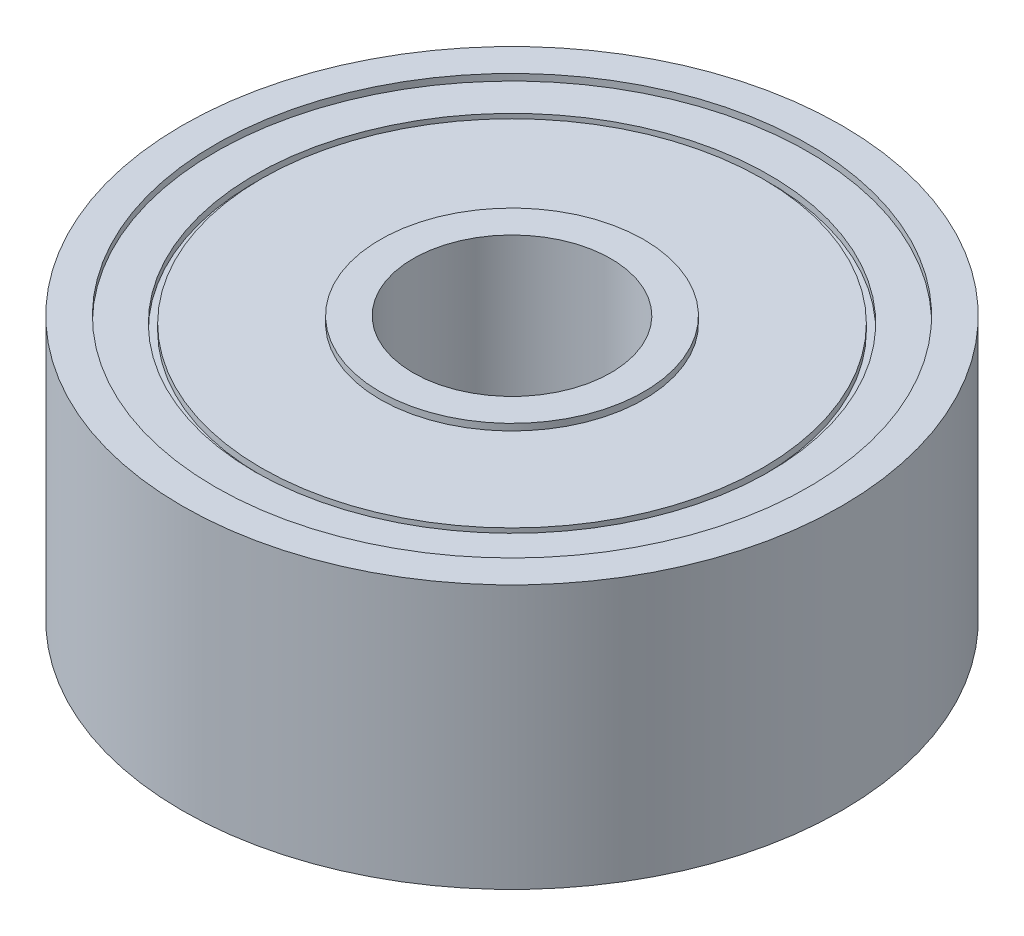
ISO-10303-21;
HEADER;
FILE_DESCRIPTION(('STEP AP214'),'2;1');
FILE_NAME('part.step','',(''),(''),'','','');
FILE_SCHEMA(('AUTOMOTIVE_DESIGN { 1 0 10303 214 1 1 1 1 }'));
ENDSEC;
DATA;
#1=APPLICATION_CONTEXT('core data for automotive mechanical design processes');
#2=APPLICATION_PROTOCOL_DEFINITION('international standard','automotive_design',2000,#1);
#3=PRODUCT_CONTEXT('',#1,'mechanical');
#4=PRODUCT('Part','Part','',(#3));
#5=PRODUCT_RELATED_PRODUCT_CATEGORY('part','',(#4));
#6=PRODUCT_DEFINITION_FORMATION('','',#4);
#7=PRODUCT_DEFINITION_CONTEXT('part definition',#1,'design');
#8=PRODUCT_DEFINITION('design','',#6,#7);
#9=PRODUCT_DEFINITION_SHAPE('','',#8);
#10=(LENGTH_UNIT() NAMED_UNIT(*) SI_UNIT(.MILLI.,.METRE.));
#11=(NAMED_UNIT(*) PLANE_ANGLE_UNIT() SI_UNIT($,.RADIAN.));
#12=(NAMED_UNIT(*) SI_UNIT($,.STERADIAN.) SOLID_ANGLE_UNIT());
#13=UNCERTAINTY_MEASURE_WITH_UNIT(LENGTH_MEASURE(1.E-05),#10,'distance_accuracy_value','');
#14=(GEOMETRIC_REPRESENTATION_CONTEXT(3) GLOBAL_UNCERTAINTY_ASSIGNED_CONTEXT((#13)) GLOBAL_UNIT_ASSIGNED_CONTEXT((#10,
#11,#12)) REPRESENTATION_CONTEXT('',''));
#15=CARTESIAN_POINT('',(0.,0.,0.));
#16=DIRECTION('',(0.,0.,1.));
#17=DIRECTION('',(1.,0.,0.));
#18=AXIS2_PLACEMENT_3D('',#15,#16,#17);
#19=CARTESIAN_POINT('',(0.,-1.9,0.));
#20=DIRECTION('',(0.,-1.,0.));
#21=DIRECTION('',(0.,0.,1.));
#22=AXIS2_PLACEMENT_3D('',#19,#20,#21);
#23=PLANE('',#22);
#24=CARTESIAN_POINT('',(0.,-1.9,0.));
#25=DIRECTION('',(0.,1.,0.));
#26=DIRECTION('',(0.,0.,1.));
#27=AXIS2_PLACEMENT_3D('',#24,#25,#26);
#28=CIRCLE('',#27,2.);
#29=CARTESIAN_POINT('',(0.,-1.9,2.));
#30=VERTEX_POINT('',#29);
#31=EDGE_CURVE('E80',#30,#30,#28,.T.);
#32=ORIENTED_EDGE('',*,*,#31,.T.);
#33=EDGE_LOOP('',(#32));
#34=FACE_BOUND('',#33,.T.);
#35=CARTESIAN_POINT('',(0.,-1.9,0.));
#36=DIRECTION('',(0.,1.,0.));
#37=DIRECTION('',(0.,0.,1.));
#38=AXIS2_PLACEMENT_3D('',#35,#36,#37);
#39=CIRCLE('',#38,3.8);
#40=CARTESIAN_POINT('',(0.,-1.9,3.8));
#41=VERTEX_POINT('',#40);
#42=EDGE_CURVE('E95',#41,#41,#39,.T.);
#43=ORIENTED_EDGE('',*,*,#42,.F.);
#44=EDGE_LOOP('',(#43));
#45=FACE_BOUND('',#44,.T.);
#46=ADVANCED_FACE('F34',(#34,#45),#23,.T.);
#47=CARTESIAN_POINT('',(0.,-2.,0.));
#48=DIRECTION('',(0.,1.,0.));
#49=DIRECTION('',(0.,0.,1.));
#50=AXIS2_PLACEMENT_3D('',#47,#48,#49);
#51=PLANE('',#50);
#52=CARTESIAN_POINT('',(0.,-2.,0.));
#53=DIRECTION('',(0.,1.,0.));
#54=DIRECTION('',(0.,0.,1.));
#55=AXIS2_PLACEMENT_3D('',#52,#53,#54);
#56=CIRCLE('',#55,1.5);
#57=CARTESIAN_POINT('',(0.,-2.,1.5));
#58=VERTEX_POINT('',#57);
#59=EDGE_CURVE('E47',#58,#58,#56,.T.);
#60=ORIENTED_EDGE('',*,*,#59,.T.);
#61=EDGE_LOOP('',(#60));
#62=FACE_BOUND('',#61,.T.);
#63=CARTESIAN_POINT('',(0.,-2.,0.));
#64=DIRECTION('',(0.,1.,0.));
#65=DIRECTION('',(0.,0.,1.));
#66=AXIS2_PLACEMENT_3D('',#63,#64,#65);
#67=CIRCLE('',#66,2.);
#68=CARTESIAN_POINT('',(0.,-2.,2.));
#69=VERTEX_POINT('',#68);
#70=EDGE_CURVE('E83',#69,#69,#67,.T.);
#71=ORIENTED_EDGE('',*,*,#70,.F.);
#72=EDGE_LOOP('',(#71));
#73=FACE_BOUND('',#72,.T.);
#74=ADVANCED_FACE('F111',(#62,#73),#51,.F.);
#75=CARTESIAN_POINT('',(0.,1.9,0.));
#76=DIRECTION('',(0.,1.,0.));
#77=DIRECTION('',(0.,0.,1.));
#78=AXIS2_PLACEMENT_3D('',#75,#76,#77);
#79=PLANE('',#78);
#80=CARTESIAN_POINT('',(0.,1.9,0.));
#81=DIRECTION('',(0.,1.,0.));
#82=DIRECTION('',(0.,0.,1.));
#83=AXIS2_PLACEMENT_3D('',#80,#81,#82);
#84=CIRCLE('',#83,2.);
#85=CARTESIAN_POINT('',(0.,1.9,2.));
#86=VERTEX_POINT('',#85);
#87=EDGE_CURVE('E56',#86,#86,#84,.T.);
#88=ORIENTED_EDGE('',*,*,#87,.F.);
#89=EDGE_LOOP('',(#88));
#90=FACE_BOUND('',#89,.T.);
#91=CARTESIAN_POINT('',(0.,1.9,0.));
#92=DIRECTION('',(0.,1.,0.));
#93=DIRECTION('',(0.,0.,1.));
#94=AXIS2_PLACEMENT_3D('',#91,#92,#93);
#95=CIRCLE('',#94,3.8);
#96=CARTESIAN_POINT('',(0.,1.9,3.8));
#97=VERTEX_POINT('',#96);
#98=EDGE_CURVE('E71',#97,#97,#95,.T.);
#99=ORIENTED_EDGE('',*,*,#98,.T.);
#100=EDGE_LOOP('',(#99));
#101=FACE_BOUND('',#100,.T.);
#102=ADVANCED_FACE('F118',(#90,#101),#79,.T.);
#103=CARTESIAN_POINT('',(0.,2.,0.));
#104=DIRECTION('',(0.,1.,0.));
#105=DIRECTION('',(0.,0.,1.));
#106=AXIS2_PLACEMENT_3D('',#103,#104,#105);
#107=PLANE('',#106);
#108=CARTESIAN_POINT('',(0.,2.,0.));
#109=DIRECTION('',(0.,1.,0.));
#110=DIRECTION('',(0.,0.,1.));
#111=AXIS2_PLACEMENT_3D('',#108,#109,#110);
#112=CIRCLE('',#111,1.5);
#113=CARTESIAN_POINT('',(0.,2.,1.5));
#114=VERTEX_POINT('',#113);
#115=EDGE_CURVE('E45',#114,#114,#112,.T.);
#116=ORIENTED_EDGE('',*,*,#115,.F.);
#117=EDGE_LOOP('',(#116));
#118=FACE_BOUND('',#117,.T.);
#119=CARTESIAN_POINT('',(0.,2.,0.));
#120=DIRECTION('',(0.,1.,0.));
#121=DIRECTION('',(0.,0.,1.));
#122=AXIS2_PLACEMENT_3D('',#119,#120,#121);
#123=CIRCLE('',#122,2.);
#124=CARTESIAN_POINT('',(0.,2.,2.));
#125=VERTEX_POINT('',#124);
#126=EDGE_CURVE('E59',#125,#125,#123,.T.);
#127=ORIENTED_EDGE('',*,*,#126,.T.);
#128=EDGE_LOOP('',(#127));
#129=FACE_BOUND('',#128,.T.);
#130=ADVANCED_FACE('F166',(#118,#129),#107,.T.);
#131=CARTESIAN_POINT('',(0.,2.,0.));
#132=DIRECTION('',(0.,1.,0.));
#133=DIRECTION('',(0.,0.,1.));
#134=AXIS2_PLACEMENT_3D('',#131,#132,#133);
#135=CIRCLE('',#134,4.5);
#136=CARTESIAN_POINT('',(0.,2.,4.5));
#137=VERTEX_POINT('',#136);
#138=EDGE_CURVE('E53',#137,#137,#135,.T.);
#139=ORIENTED_EDGE('',*,*,#138,.F.);
#140=EDGE_LOOP('',(#139));
#141=FACE_BOUND('',#140,.T.);
#142=CARTESIAN_POINT('',(0.,2.,0.));
#143=DIRECTION('',(0.,1.,0.));
#144=DIRECTION('',(0.,0.,1.));
#145=AXIS2_PLACEMENT_3D('',#142,#143,#144);
#146=CIRCLE('',#145,5.);
#147=CARTESIAN_POINT('',(0.,2.,5.));
#148=VERTEX_POINT('',#147);
#149=EDGE_CURVE('E10',#148,#148,#146,.T.);
#150=ORIENTED_EDGE('',*,*,#149,.T.);
#151=EDGE_LOOP('',(#150));
#152=FACE_BOUND('',#151,.T.);
#153=ADVANCED_FACE('F144',(#141,#152),#107,.T.);
#154=CARTESIAN_POINT('',(0.,-2.,0.));
#155=DIRECTION('',(0.,1.,0.));
#156=DIRECTION('',(0.,0.,1.));
#157=AXIS2_PLACEMENT_3D('',#154,#155,#156);
#158=CIRCLE('',#157,4.5);
#159=CARTESIAN_POINT('',(0.,-2.,4.5));
#160=VERTEX_POINT('',#159);
#161=EDGE_CURVE('E77',#160,#160,#158,.T.);
#162=ORIENTED_EDGE('',*,*,#161,.T.);
#163=EDGE_LOOP('',(#162));
#164=FACE_BOUND('',#163,.T.);
#165=CARTESIAN_POINT('',(0.,-2.,0.));
#166=DIRECTION('',(0.,1.,0.));
#167=DIRECTION('',(0.,0.,1.));
#168=AXIS2_PLACEMENT_3D('',#165,#166,#167);
#169=CIRCLE('',#168,5.);
#170=CARTESIAN_POINT('',(0.,-2.,5.));
#171=VERTEX_POINT('',#170);
#172=EDGE_CURVE('E38',#171,#171,#169,.T.);
#173=ORIENTED_EDGE('',*,*,#172,.F.);
#174=EDGE_LOOP('',(#173));
#175=FACE_BOUND('',#174,.T.);
#176=ADVANCED_FACE('F120',(#164,#175),#51,.F.);
#177=CARTESIAN_POINT('',(0.,2.,0.));
#178=DIRECTION('',(0.,-1.,0.));
#179=DIRECTION('',(0.,0.,-1.));
#180=AXIS2_PLACEMENT_3D('',#177,#178,#179);
#181=CYLINDRICAL_SURFACE('',#180,5.);
#182=ORIENTED_EDGE('',*,*,#149,.F.);
#183=EDGE_LOOP('',(#182));
#184=FACE_BOUND('',#183,.T.);
#185=ORIENTED_EDGE('',*,*,#172,.T.);
#186=EDGE_LOOP('',(#185));
#187=FACE_BOUND('',#186,.T.);
#188=ADVANCED_FACE('F36',(#184,#187),#181,.T.);
#189=CARTESIAN_POINT('',(0.,2.,0.));
#190=DIRECTION('',(0.,-1.,0.));
#191=DIRECTION('',(0.,0.,-1.));
#192=AXIS2_PLACEMENT_3D('',#189,#190,#191);
#193=CYLINDRICAL_SURFACE('',#192,1.5);
#194=ORIENTED_EDGE('',*,*,#115,.T.);
#195=EDGE_LOOP('',(#194));
#196=FACE_BOUND('',#195,.T.);
#197=ORIENTED_EDGE('',*,*,#59,.F.);
#198=EDGE_LOOP('',(#197));
#199=FACE_BOUND('',#198,.T.);
#200=ADVANCED_FACE('F148',(#196,#199),#193,.F.);
#201=CARTESIAN_POINT('',(0.,1.9,0.));
#202=DIRECTION('',(0.,1.,0.));
#203=DIRECTION('',(0.,0.,1.));
#204=AXIS2_PLACEMENT_3D('',#201,#202,#203);
#205=CYLINDRICAL_SURFACE('',#204,4.5);
#206=CARTESIAN_POINT('',(0.,1.9,0.));
#207=DIRECTION('',(0.,1.,0.));
#208=DIRECTION('',(0.,0.,1.));
#209=AXIS2_PLACEMENT_3D('',#206,#207,#208);
#210=CIRCLE('',#209,4.5);
#211=CARTESIAN_POINT('',(0.,1.9,4.5));
#212=VERTEX_POINT('',#211);
#213=EDGE_CURVE('E50',#212,#212,#210,.T.);
#214=ORIENTED_EDGE('',*,*,#213,.F.);
#215=EDGE_LOOP('',(#214));
#216=FACE_BOUND('',#215,.T.);
#217=ORIENTED_EDGE('',*,*,#138,.T.);
#218=EDGE_LOOP('',(#217));
#219=FACE_BOUND('',#218,.T.);
#220=ADVANCED_FACE('F153',(#216,#219),#205,.F.);
#221=CARTESIAN_POINT('',(0.,1.9,0.));
#222=DIRECTION('',(0.,1.,0.));
#223=DIRECTION('',(0.,0.,1.));
#224=AXIS2_PLACEMENT_3D('',#221,#222,#223);
#225=CIRCLE('',#224,3.9);
#226=CARTESIAN_POINT('',(0.,1.9,3.9));
#227=VERTEX_POINT('',#226);
#228=EDGE_CURVE('E65',#227,#227,#225,.T.);
#229=ORIENTED_EDGE('',*,*,#228,.F.);
#230=EDGE_LOOP('',(#229));
#231=FACE_BOUND('',#230,.T.);
#232=ORIENTED_EDGE('',*,*,#213,.T.);
#233=EDGE_LOOP('',(#232));
#234=FACE_BOUND('',#233,.T.);
#235=ADVANCED_FACE('F159',(#231,#234),#79,.T.);
#236=CARTESIAN_POINT('',(0.,1.9,0.));
#237=DIRECTION('',(0.,1.,0.));
#238=DIRECTION('',(0.,0.,1.));
#239=AXIS2_PLACEMENT_3D('',#236,#237,#238);
#240=CYLINDRICAL_SURFACE('',#239,2.);
#241=ORIENTED_EDGE('',*,*,#87,.T.);
#242=EDGE_LOOP('',(#241));
#243=FACE_BOUND('',#242,.T.);
#244=ORIENTED_EDGE('',*,*,#126,.F.);
#245=EDGE_LOOP('',(#244));
#246=FACE_BOUND('',#245,.T.);
#247=ADVANCED_FACE('F182',(#243,#246),#240,.T.);
#248=CARTESIAN_POINT('',(0.,1.8,0.));
#249=DIRECTION('',(0.,1.,0.));
#250=DIRECTION('',(0.,0.,1.));
#251=AXIS2_PLACEMENT_3D('',#248,#249,#250);
#252=CYLINDRICAL_SURFACE('',#251,3.9);
#253=CARTESIAN_POINT('',(0.,1.8,0.));
#254=DIRECTION('',(0.,1.,0.));
#255=DIRECTION('',(0.,0.,1.));
#256=AXIS2_PLACEMENT_3D('',#253,#254,#255);
#257=CIRCLE('',#256,3.9);
#258=CARTESIAN_POINT('',(0.,1.8,3.9));
#259=VERTEX_POINT('',#258);
#260=EDGE_CURVE('E62',#259,#259,#257,.T.);
#261=ORIENTED_EDGE('',*,*,#260,.F.);
#262=EDGE_LOOP('',(#261));
#263=FACE_BOUND('',#262,.T.);
#264=ORIENTED_EDGE('',*,*,#228,.T.);
#265=EDGE_LOOP('',(#264));
#266=FACE_BOUND('',#265,.T.);
#267=ADVANCED_FACE('F184',(#263,#266),#252,.F.);
#268=CARTESIAN_POINT('',(0.,1.8,0.));
#269=DIRECTION('',(0.,1.,0.));
#270=DIRECTION('',(0.,0.,1.));
#271=AXIS2_PLACEMENT_3D('',#268,#269,#270);
#272=PLANE('',#271);
#273=CARTESIAN_POINT('',(0.,1.8,0.));
#274=DIRECTION('',(0.,1.,0.));
#275=DIRECTION('',(0.,0.,1.));
#276=AXIS2_PLACEMENT_3D('',#273,#274,#275);
#277=CIRCLE('',#276,3.8);
#278=CARTESIAN_POINT('',(0.,1.8,3.8));
#279=VERTEX_POINT('',#278);
#280=EDGE_CURVE('E68',#279,#279,#277,.T.);
#281=ORIENTED_EDGE('',*,*,#280,.F.);
#282=EDGE_LOOP('',(#281));
#283=FACE_BOUND('',#282,.T.);
#284=ORIENTED_EDGE('',*,*,#260,.T.);
#285=EDGE_LOOP('',(#284));
#286=FACE_BOUND('',#285,.T.);
#287=ADVANCED_FACE('F133',(#283,#286),#272,.T.);
#288=CARTESIAN_POINT('',(0.,1.8,0.));
#289=DIRECTION('',(0.,1.,0.));
#290=DIRECTION('',(0.,0.,1.));
#291=AXIS2_PLACEMENT_3D('',#288,#289,#290);
#292=CYLINDRICAL_SURFACE('',#291,3.8);
#293=ORIENTED_EDGE('',*,*,#280,.T.);
#294=EDGE_LOOP('',(#293));
#295=FACE_BOUND('',#294,.T.);
#296=ORIENTED_EDGE('',*,*,#98,.F.);
#297=EDGE_LOOP('',(#296));
#298=FACE_BOUND('',#297,.T.);
#299=ADVANCED_FACE('F125',(#295,#298),#292,.T.);
#300=CARTESIAN_POINT('',(0.,-1.9,0.));
#301=DIRECTION('',(0.,1.,0.));
#302=DIRECTION('',(0.,0.,1.));
#303=AXIS2_PLACEMENT_3D('',#300,#301,#302);
#304=CIRCLE('',#303,3.9);
#305=CARTESIAN_POINT('',(0.,-1.9,3.9));
#306=VERTEX_POINT('',#305);
#307=EDGE_CURVE('E89',#306,#306,#304,.T.);
#308=ORIENTED_EDGE('',*,*,#307,.T.);
#309=EDGE_LOOP('',(#308));
#310=FACE_BOUND('',#309,.T.);
#311=CARTESIAN_POINT('',(0.,-1.9,0.));
#312=DIRECTION('',(0.,1.,0.));
#313=DIRECTION('',(0.,0.,1.));
#314=AXIS2_PLACEMENT_3D('',#311,#312,#313);
#315=CIRCLE('',#314,4.5);
#316=CARTESIAN_POINT('',(0.,-1.9,4.5));
#317=VERTEX_POINT('',#316);
#318=EDGE_CURVE('E74',#317,#317,#315,.T.);
#319=ORIENTED_EDGE('',*,*,#318,.F.);
#320=EDGE_LOOP('',(#319));
#321=FACE_BOUND('',#320,.T.);
#322=ADVANCED_FACE('F114',(#310,#321),#23,.T.);
#323=CARTESIAN_POINT('',(0.,-1.9,0.));
#324=DIRECTION('',(0.,-1.,0.));
#325=DIRECTION('',(0.,0.,-1.));
#326=AXIS2_PLACEMENT_3D('',#323,#324,#325);
#327=CYLINDRICAL_SURFACE('',#326,4.5);
#328=ORIENTED_EDGE('',*,*,#318,.T.);
#329=EDGE_LOOP('',(#328));
#330=FACE_BOUND('',#329,.T.);
#331=ORIENTED_EDGE('',*,*,#161,.F.);
#332=EDGE_LOOP('',(#331));
#333=FACE_BOUND('',#332,.T.);
#334=ADVANCED_FACE('F124',(#330,#333),#327,.F.);
#335=CARTESIAN_POINT('',(0.,-1.9,0.));
#336=DIRECTION('',(0.,-1.,0.));
#337=DIRECTION('',(0.,0.,-1.));
#338=AXIS2_PLACEMENT_3D('',#335,#336,#337);
#339=CYLINDRICAL_SURFACE('',#338,2.);
#340=ORIENTED_EDGE('',*,*,#31,.F.);
#341=EDGE_LOOP('',(#340));
#342=FACE_BOUND('',#341,.T.);
#343=ORIENTED_EDGE('',*,*,#70,.T.);
#344=EDGE_LOOP('',(#343));
#345=FACE_BOUND('',#344,.T.);
#346=ADVANCED_FACE('F131',(#342,#345),#339,.T.);
#347=CARTESIAN_POINT('',(0.,-1.8,0.));
#348=DIRECTION('',(0.,-1.,0.));
#349=DIRECTION('',(0.,0.,1.));
#350=AXIS2_PLACEMENT_3D('',#347,#348,#349);
#351=PLANE('',#350);
#352=CARTESIAN_POINT('',(0.,-1.8,0.));
#353=DIRECTION('',(0.,1.,0.));
#354=DIRECTION('',(0.,0.,1.));
#355=AXIS2_PLACEMENT_3D('',#352,#353,#354);
#356=CIRCLE('',#355,3.9);
#357=CARTESIAN_POINT('',(0.,-1.8,3.9));
#358=VERTEX_POINT('',#357);
#359=EDGE_CURVE('E86',#358,#358,#356,.T.);
#360=ORIENTED_EDGE('',*,*,#359,.F.);
#361=EDGE_LOOP('',(#360));
#362=FACE_BOUND('',#361,.T.);
#363=CARTESIAN_POINT('',(0.,-1.8,0.));
#364=DIRECTION('',(0.,1.,0.));
#365=DIRECTION('',(0.,0.,1.));
#366=AXIS2_PLACEMENT_3D('',#363,#364,#365);
#367=CIRCLE('',#366,3.8);
#368=CARTESIAN_POINT('',(0.,-1.8,3.8));
#369=VERTEX_POINT('',#368);
#370=EDGE_CURVE('E92',#369,#369,#367,.T.);
#371=ORIENTED_EDGE('',*,*,#370,.T.);
#372=EDGE_LOOP('',(#371));
#373=FACE_BOUND('',#372,.T.);
#374=ADVANCED_FACE('F101',(#362,#373),#351,.T.);
#375=CARTESIAN_POINT('',(0.,-1.8,0.));
#376=DIRECTION('',(0.,-1.,0.));
#377=DIRECTION('',(0.,0.,-1.));
#378=AXIS2_PLACEMENT_3D('',#375,#376,#377);
#379=CYLINDRICAL_SURFACE('',#378,3.9);
#380=ORIENTED_EDGE('',*,*,#359,.T.);
#381=EDGE_LOOP('',(#380));
#382=FACE_BOUND('',#381,.T.);
#383=ORIENTED_EDGE('',*,*,#307,.F.);
#384=EDGE_LOOP('',(#383));
#385=FACE_BOUND('',#384,.T.);
#386=ADVANCED_FACE('F106',(#382,#385),#379,.F.);
#387=CARTESIAN_POINT('',(0.,-1.8,0.));
#388=DIRECTION('',(0.,-1.,0.));
#389=DIRECTION('',(0.,0.,-1.));
#390=AXIS2_PLACEMENT_3D('',#387,#388,#389);
#391=CYLINDRICAL_SURFACE('',#390,3.8);
#392=ORIENTED_EDGE('',*,*,#370,.F.);
#393=EDGE_LOOP('',(#392));
#394=FACE_BOUND('',#393,.T.);
#395=ORIENTED_EDGE('',*,*,#42,.T.);
#396=EDGE_LOOP('',(#395));
#397=FACE_BOUND('',#396,.T.);
#398=ADVANCED_FACE('F103',(#394,#397),#391,.T.);
#399=CLOSED_SHELL('',(#46,#74,#102,#130,#153,#176,#188,#200,#220,#235,#247,#267,#287,#299,#322,
#334,#346,#374,#386,#398));
#400=MANIFOLD_SOLID_BREP('B2',#399);
#401=ADVANCED_BREP_SHAPE_REPRESENTATION('',(#18,#400),#14);
#402=SHAPE_DEFINITION_REPRESENTATION(#9,#401);
ENDSEC;
END-ISO-10303-21;
